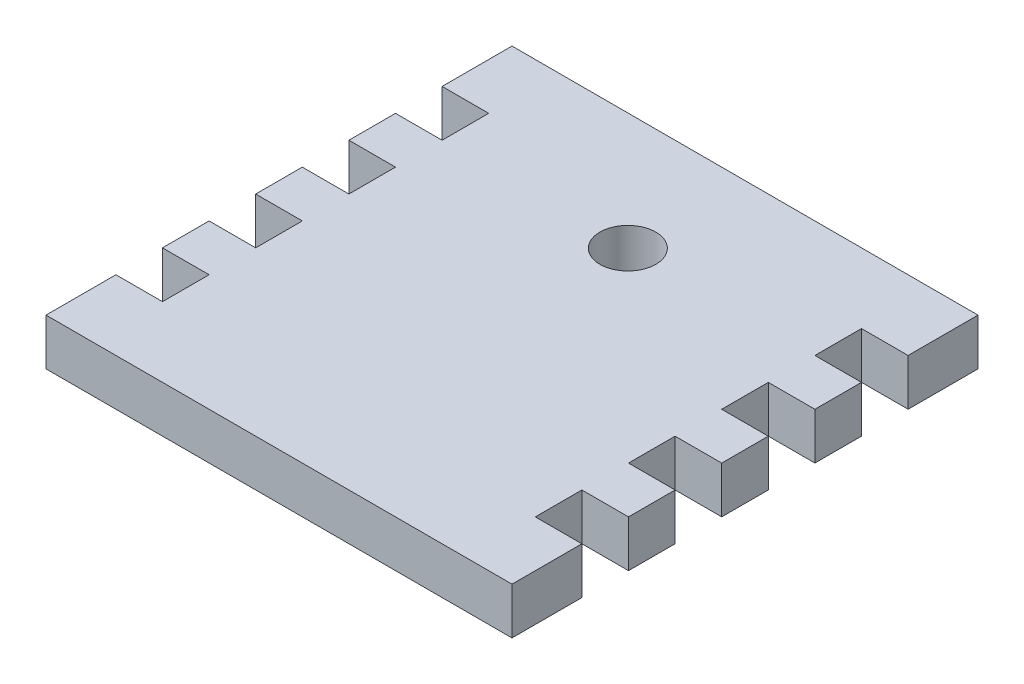
ISO-10303-21;
HEADER;
FILE_DESCRIPTION(('STEP AP214'),'2;1');
FILE_NAME('part.step','',(''),(''),'','','');
FILE_SCHEMA(('AUTOMOTIVE_DESIGN { 1 0 10303 214 1 1 1 1 }'));
ENDSEC;
DATA;
#1=APPLICATION_CONTEXT('core data for automotive mechanical design processes');
#2=APPLICATION_PROTOCOL_DEFINITION('international standard','automotive_design',2000,#1);
#3=PRODUCT_CONTEXT('',#1,'mechanical');
#4=PRODUCT('Part','Part','',(#3));
#5=PRODUCT_RELATED_PRODUCT_CATEGORY('part','',(#4));
#6=PRODUCT_DEFINITION_FORMATION('','',#4);
#7=PRODUCT_DEFINITION_CONTEXT('part definition',#1,'design');
#8=PRODUCT_DEFINITION('design','',#6,#7);
#9=PRODUCT_DEFINITION_SHAPE('','',#8);
#10=(LENGTH_UNIT() NAMED_UNIT(*) SI_UNIT(.MILLI.,.METRE.));
#11=(NAMED_UNIT(*) PLANE_ANGLE_UNIT() SI_UNIT($,.RADIAN.));
#12=(NAMED_UNIT(*) SI_UNIT($,.STERADIAN.) SOLID_ANGLE_UNIT());
#13=UNCERTAINTY_MEASURE_WITH_UNIT(LENGTH_MEASURE(1.E-05),#10,'distance_accuracy_value','');
#14=(GEOMETRIC_REPRESENTATION_CONTEXT(3) GLOBAL_UNCERTAINTY_ASSIGNED_CONTEXT((#13)) GLOBAL_UNIT_ASSIGNED_CONTEXT((#10,
#11,#12)) REPRESENTATION_CONTEXT('',''));
#15=CARTESIAN_POINT('',(0.,0.,0.));
#16=DIRECTION('',(0.,0.,1.));
#17=DIRECTION('',(1.,0.,0.));
#18=AXIS2_PLACEMENT_3D('',#15,#16,#17);
#19=CARTESIAN_POINT('',(-16.0108949416342,5.08,-17.8887159533074));
#20=DIRECTION('',(1.,0.,0.));
#21=DIRECTION('',(0.,0.,-1.));
#22=AXIS2_PLACEMENT_3D('',#19,#20,#21);
#23=PLANE('',#22);
#24=DIRECTION('',(0.,0.,1.));
#25=VECTOR('',#24,1.);
#26=CARTESIAN_POINT('',(-16.0108949416342,0.,-17.8887159533074));
#27=LINE('',#26,#25);
#28=CARTESIAN_POINT('',(-16.0108949416342,0.,4.97128404669261));
#29=VERTEX_POINT('',#28);
#30=CARTESIAN_POINT('',(-16.0108949416342,0.,10.0512840466926));
#31=VERTEX_POINT('',#30);
#32=EDGE_CURVE('E291',#29,#31,#27,.T.);
#33=ORIENTED_EDGE('',*,*,#32,.T.);
#34=DIRECTION('',(0.,1.,0.));
#35=VECTOR('',#34,1.);
#36=CARTESIAN_POINT('',(-16.0108949416342,0.,10.0512840466926));
#37=LINE('',#36,#35);
#38=CARTESIAN_POINT('',(-16.0108949416342,5.08,10.0512840466926));
#39=VERTEX_POINT('',#38);
#40=EDGE_CURVE('E496',#31,#39,#37,.T.);
#41=ORIENTED_EDGE('',*,*,#40,.T.);
#42=DIRECTION('',(0.,0.,1.));
#43=VECTOR('',#42,1.);
#44=CARTESIAN_POINT('',(-16.0108949416342,5.08,-17.8887159533074));
#45=LINE('',#44,#43);
#46=CARTESIAN_POINT('',(-16.0108949416342,5.08,4.97128404669261));
#47=VERTEX_POINT('',#46);
#48=EDGE_CURVE('E584',#47,#39,#45,.T.);
#49=ORIENTED_EDGE('',*,*,#48,.F.);
#50=DIRECTION('',(0.,1.,0.));
#51=VECTOR('',#50,1.);
#52=CARTESIAN_POINT('',(-16.0108949416342,0.,4.97128404669261));
#53=LINE('',#52,#51);
#54=EDGE_CURVE('E455',#29,#47,#53,.T.);
#55=ORIENTED_EDGE('',*,*,#54,.F.);
#56=EDGE_LOOP('',(#33,#41,#49,#55));
#57=FACE_BOUND('',#56,.T.);
#58=ADVANCED_FACE('F33',(#57),#23,.F.);
#59=CARTESIAN_POINT('',(-16.0108949416342,5.08,15.1312840466926));
#60=VERTEX_POINT('',#59);
#61=CARTESIAN_POINT('',(-16.0108949416342,5.08,20.2112840466926));
#62=VERTEX_POINT('',#61);
#63=EDGE_CURVE('E283',#60,#62,#45,.T.);
#64=ORIENTED_EDGE('',*,*,#63,.F.);
#65=DIRECTION('',(0.,1.,0.));
#66=VECTOR('',#65,1.);
#67=CARTESIAN_POINT('',(-16.0108949416342,0.,15.1312840466926));
#68=LINE('',#67,#66);
#69=CARTESIAN_POINT('',(-16.0108949416342,0.,15.1312840466926));
#70=VERTEX_POINT('',#69);
#71=EDGE_CURVE('E269',#70,#60,#68,.T.);
#72=ORIENTED_EDGE('',*,*,#71,.F.);
#73=CARTESIAN_POINT('',(-16.0108949416342,0.,20.2112840466926));
#74=VERTEX_POINT('',#73);
#75=EDGE_CURVE('E281',#70,#74,#27,.T.);
#76=ORIENTED_EDGE('',*,*,#75,.T.);
#77=DIRECTION('',(0.,1.,0.));
#78=VECTOR('',#77,1.);
#79=CARTESIAN_POINT('',(-16.0108949416342,0.,20.2112840466926));
#80=LINE('',#79,#78);
#81=EDGE_CURVE('E613',#74,#62,#80,.T.);
#82=ORIENTED_EDGE('',*,*,#81,.T.);
#83=EDGE_LOOP('',(#64,#72,#76,#82));
#84=FACE_BOUND('',#83,.T.);
#85=ADVANCED_FACE('F279',(#84),#23,.F.);
#86=CARTESIAN_POINT('',(-16.0108949416342,5.08,-5.18871595330739));
#87=VERTEX_POINT('',#86);
#88=CARTESIAN_POINT('',(-16.0108949416342,5.08,-0.108715953307394));
#89=VERTEX_POINT('',#88);
#90=EDGE_CURVE('E501',#87,#89,#45,.T.);
#91=ORIENTED_EDGE('',*,*,#90,.F.);
#92=DIRECTION('',(0.,1.,0.));
#93=VECTOR('',#92,1.);
#94=CARTESIAN_POINT('',(-16.0108949416342,0.,-5.18871595330739));
#95=LINE('',#94,#93);
#96=CARTESIAN_POINT('',(-16.0108949416342,0.,-5.18871595330739));
#97=VERTEX_POINT('',#96);
#98=EDGE_CURVE('E429',#97,#87,#95,.T.);
#99=ORIENTED_EDGE('',*,*,#98,.F.);
#100=CARTESIAN_POINT('',(-16.0108949416342,0.,-0.108715953307394));
#101=VERTEX_POINT('',#100);
#102=EDGE_CURVE('E295',#97,#101,#27,.T.);
#103=ORIENTED_EDGE('',*,*,#102,.T.);
#104=DIRECTION('',(0.,1.,0.));
#105=VECTOR('',#104,1.);
#106=CARTESIAN_POINT('',(-16.0108949416342,0.,-0.108715953307394));
#107=LINE('',#106,#105);
#108=EDGE_CURVE('E485',#101,#89,#107,.T.);
#109=ORIENTED_EDGE('',*,*,#108,.T.);
#110=EDGE_LOOP('',(#91,#99,#103,#109));
#111=FACE_BOUND('',#110,.T.);
#112=ADVANCED_FACE('F582',(#111),#23,.F.);
#113=CARTESIAN_POINT('',(-16.0108949416342,5.08,25.2912840466926));
#114=VERTEX_POINT('',#113);
#115=CARTESIAN_POINT('',(-16.0108949416342,5.08,32.9112840466926));
#116=VERTEX_POINT('',#115);
#117=EDGE_CURVE('E312',#114,#116,#45,.T.);
#118=ORIENTED_EDGE('',*,*,#117,.F.);
#119=DIRECTION('',(0.,1.,0.));
#120=VECTOR('',#119,1.);
#121=CARTESIAN_POINT('',(-16.0108949416342,0.,25.2912840466926));
#122=LINE('',#121,#120);
#123=CARTESIAN_POINT('',(-16.0108949416342,0.,25.2912840466926));
#124=VERTEX_POINT('',#123);
#125=EDGE_CURVE('E598',#124,#114,#122,.T.);
#126=ORIENTED_EDGE('',*,*,#125,.F.);
#127=CARTESIAN_POINT('',(-16.0108949416342,0.,32.9112840466926));
#128=VERTEX_POINT('',#127);
#129=EDGE_CURVE('E292',#124,#128,#27,.T.);
#130=ORIENTED_EDGE('',*,*,#129,.T.);
#131=DIRECTION('',(0.,-1.,0.));
#132=VECTOR('',#131,1.);
#133=CARTESIAN_POINT('',(-16.0108949416342,5.08,32.9112840466926));
#134=LINE('',#133,#132);
#135=EDGE_CURVE('E11',#116,#128,#134,.T.);
#136=ORIENTED_EDGE('',*,*,#135,.F.);
#137=EDGE_LOOP('',(#118,#126,#130,#136));
#138=FACE_BOUND('',#137,.T.);
#139=ADVANCED_FACE('F597',(#138),#23,.F.);
#140=CARTESIAN_POINT('',(34.7891050583658,5.08,-17.8887159533074));
#141=DIRECTION('',(-1.,0.,0.));
#142=DIRECTION('',(0.,0.,1.));
#143=AXIS2_PLACEMENT_3D('',#140,#141,#142);
#144=PLANE('',#143);
#145=DIRECTION('',(0.,0.,-1.));
#146=VECTOR('',#145,1.);
#147=CARTESIAN_POINT('',(34.7891050583658,5.08,-17.8887159533074));
#148=LINE('',#147,#146);
#149=CARTESIAN_POINT('',(34.7891050583658,5.08,20.2112840466926));
#150=VERTEX_POINT('',#149);
#151=CARTESIAN_POINT('',(34.7891050583658,5.08,15.1312840466926));
#152=VERTEX_POINT('',#151);
#153=EDGE_CURVE('E503',#150,#152,#148,.T.);
#154=ORIENTED_EDGE('',*,*,#153,.F.);
#155=DIRECTION('',(0.,1.,0.));
#156=VECTOR('',#155,1.);
#157=CARTESIAN_POINT('',(34.7891050583658,0.,20.2112840466926));
#158=LINE('',#157,#156);
#159=CARTESIAN_POINT('',(34.7891050583658,0.,20.2112840466926));
#160=VERTEX_POINT('',#159);
#161=EDGE_CURVE('E356',#160,#150,#158,.T.);
#162=ORIENTED_EDGE('',*,*,#161,.F.);
#163=DIRECTION('',(0.,0.,-1.));
#164=VECTOR('',#163,1.);
#165=CARTESIAN_POINT('',(34.7891050583658,0.,-17.8887159533074));
#166=LINE('',#165,#164);
#167=CARTESIAN_POINT('',(34.7891050583658,0.,15.1312840466926));
#168=VERTEX_POINT('',#167);
#169=EDGE_CURVE('E310',#160,#168,#166,.T.);
#170=ORIENTED_EDGE('',*,*,#169,.T.);
#171=DIRECTION('',(0.,1.,0.));
#172=VECTOR('',#171,1.);
#173=CARTESIAN_POINT('',(34.7891050583658,0.,15.1312840466926));
#174=LINE('',#173,#172);
#175=EDGE_CURVE('E382',#168,#152,#174,.T.);
#176=ORIENTED_EDGE('',*,*,#175,.T.);
#177=EDGE_LOOP('',(#154,#162,#170,#176));
#178=FACE_BOUND('',#177,.T.);
#179=ADVANCED_FACE('F628',(#178),#144,.F.);
#180=CARTESIAN_POINT('',(34.7891050583658,5.08,10.0512840466926));
#181=VERTEX_POINT('',#180);
#182=CARTESIAN_POINT('',(34.7891050583658,5.08,4.97128404669261));
#183=VERTEX_POINT('',#182);
#184=EDGE_CURVE('E507',#181,#183,#148,.T.);
#185=ORIENTED_EDGE('',*,*,#184,.F.);
#186=DIRECTION('',(0.,1.,0.));
#187=VECTOR('',#186,1.);
#188=CARTESIAN_POINT('',(34.7891050583658,0.,10.0512840466926));
#189=LINE('',#188,#187);
#190=CARTESIAN_POINT('',(34.7891050583658,0.,10.0512840466926));
#191=VERTEX_POINT('',#190);
#192=EDGE_CURVE('E351',#191,#181,#189,.T.);
#193=ORIENTED_EDGE('',*,*,#192,.F.);
#194=CARTESIAN_POINT('',(34.7891050583658,0.,4.97128404669261));
#195=VERTEX_POINT('',#194);
#196=EDGE_CURVE('E530',#191,#195,#166,.T.);
#197=ORIENTED_EDGE('',*,*,#196,.T.);
#198=DIRECTION('',(0.,1.,0.));
#199=VECTOR('',#198,1.);
#200=CARTESIAN_POINT('',(34.7891050583658,0.,4.97128404669261));
#201=LINE('',#200,#199);
#202=EDGE_CURVE('E377',#195,#183,#201,.T.);
#203=ORIENTED_EDGE('',*,*,#202,.T.);
#204=EDGE_LOOP('',(#185,#193,#197,#203));
#205=FACE_BOUND('',#204,.T.);
#206=ADVANCED_FACE('F527',(#205),#144,.F.);
#207=CARTESIAN_POINT('',(34.7891050583658,0.,32.9112840466926));
#208=VERTEX_POINT('',#207);
#209=CARTESIAN_POINT('',(34.7891050583658,0.,25.2912840466926));
#210=VERTEX_POINT('',#209);
#211=EDGE_CURVE('E306',#208,#210,#166,.T.);
#212=ORIENTED_EDGE('',*,*,#211,.T.);
#213=DIRECTION('',(0.,1.,0.));
#214=VECTOR('',#213,1.);
#215=CARTESIAN_POINT('',(34.7891050583658,0.,25.2912840466926));
#216=LINE('',#215,#214);
#217=CARTESIAN_POINT('',(34.7891050583658,5.08,25.2912840466926));
#218=VERTEX_POINT('',#217);
#219=EDGE_CURVE('E359',#210,#218,#216,.T.);
#220=ORIENTED_EDGE('',*,*,#219,.T.);
#221=CARTESIAN_POINT('',(34.7891050583658,5.08,32.9112840466926));
#222=VERTEX_POINT('',#221);
#223=EDGE_CURVE('E326',#222,#218,#148,.T.);
#224=ORIENTED_EDGE('',*,*,#223,.F.);
#225=DIRECTION('',(0.,-1.,0.));
#226=VECTOR('',#225,1.);
#227=CARTESIAN_POINT('',(34.7891050583658,5.08,32.9112840466926));
#228=LINE('',#227,#226);
#229=EDGE_CURVE('E41',#222,#208,#228,.T.);
#230=ORIENTED_EDGE('',*,*,#229,.T.);
#231=EDGE_LOOP('',(#212,#220,#224,#230));
#232=FACE_BOUND('',#231,.T.);
#233=ADVANCED_FACE('F323',(#232),#144,.F.);
#234=CARTESIAN_POINT('',(34.7891050583658,5.08,-0.108715953307394));
#235=VERTEX_POINT('',#234);
#236=CARTESIAN_POINT('',(34.7891050583658,5.08,-5.18871595330739));
#237=VERTEX_POINT('',#236);
#238=EDGE_CURVE('E508',#235,#237,#148,.T.);
#239=ORIENTED_EDGE('',*,*,#238,.F.);
#240=DIRECTION('',(0.,1.,0.));
#241=VECTOR('',#240,1.);
#242=CARTESIAN_POINT('',(34.7891050583658,0.,-0.108715953307394));
#243=LINE('',#242,#241);
#244=CARTESIAN_POINT('',(34.7891050583658,0.,-0.108715953307394));
#245=VERTEX_POINT('',#244);
#246=EDGE_CURVE('E398',#245,#235,#243,.T.);
#247=ORIENTED_EDGE('',*,*,#246,.F.);
#248=CARTESIAN_POINT('',(34.7891050583658,0.,-5.18871595330739));
#249=VERTEX_POINT('',#248);
#250=EDGE_CURVE('E544',#245,#249,#166,.T.);
#251=ORIENTED_EDGE('',*,*,#250,.T.);
#252=DIRECTION('',(0.,1.,0.));
#253=VECTOR('',#252,1.);
#254=CARTESIAN_POINT('',(34.7891050583658,0.,-5.18871595330739));
#255=LINE('',#254,#253);
#256=EDGE_CURVE('E403',#249,#237,#255,.T.);
#257=ORIENTED_EDGE('',*,*,#256,.T.);
#258=EDGE_LOOP('',(#239,#247,#251,#257));
#259=FACE_BOUND('',#258,.T.);
#260=ADVANCED_FACE('F542',(#259),#144,.F.);
#261=CARTESIAN_POINT('',(-16.0108949416342,0.,-17.8887159533074));
#262=VERTEX_POINT('',#261);
#263=CARTESIAN_POINT('',(-16.0108949416342,0.,-10.2687159533074));
#264=VERTEX_POINT('',#263);
#265=EDGE_CURVE('E297',#262,#264,#27,.T.);
#266=ORIENTED_EDGE('',*,*,#265,.T.);
#267=DIRECTION('',(0.,1.,0.));
#268=VECTOR('',#267,1.);
#269=CARTESIAN_POINT('',(-16.0108949416342,0.,-10.2687159533074));
#270=LINE('',#269,#268);
#271=CARTESIAN_POINT('',(-16.0108949416342,5.08,-10.2687159533074));
#272=VERTEX_POINT('',#271);
#273=EDGE_CURVE('E460',#264,#272,#270,.T.);
#274=ORIENTED_EDGE('',*,*,#273,.T.);
#275=CARTESIAN_POINT('',(-16.0108949416342,5.08,-17.8887159533074));
#276=VERTEX_POINT('',#275);
#277=EDGE_CURVE('E497',#276,#272,#45,.T.);
#278=ORIENTED_EDGE('',*,*,#277,.F.);
#279=DIRECTION('',(0.,-1.,0.));
#280=VECTOR('',#279,1.);
#281=CARTESIAN_POINT('',(-16.0108949416342,5.08,-17.8887159533074));
#282=LINE('',#281,#280);
#283=EDGE_CURVE('E313',#276,#262,#282,.T.);
#284=ORIENTED_EDGE('',*,*,#283,.T.);
#285=EDGE_LOOP('',(#266,#274,#278,#284));
#286=FACE_BOUND('',#285,.T.);
#287=ADVANCED_FACE('F35',(#286),#23,.F.);
#288=CARTESIAN_POINT('',(-16.0108949416342,5.08,32.9112840466926));
#289=DIRECTION('',(0.,0.,-1.));
#290=DIRECTION('',(-1.,0.,0.));
#291=AXIS2_PLACEMENT_3D('',#288,#289,#290);
#292=PLANE('',#291);
#293=DIRECTION('',(1.,0.,0.));
#294=VECTOR('',#293,1.);
#295=CARTESIAN_POINT('',(-16.0108949416342,0.,32.9112840466926));
#296=LINE('',#295,#294);
#297=EDGE_CURVE('E301',#128,#208,#296,.T.);
#298=ORIENTED_EDGE('',*,*,#297,.T.);
#299=ORIENTED_EDGE('',*,*,#229,.F.);
#300=DIRECTION('',(1.,0.,0.));
#301=VECTOR('',#300,1.);
#302=CARTESIAN_POINT('',(-16.0108949416342,5.08,32.9112840466926));
#303=LINE('',#302,#301);
#304=EDGE_CURVE('E500',#116,#222,#303,.T.);
#305=ORIENTED_EDGE('',*,*,#304,.F.);
#306=ORIENTED_EDGE('',*,*,#135,.T.);
#307=EDGE_LOOP('',(#298,#299,#305,#306));
#308=FACE_BOUND('',#307,.T.);
#309=ADVANCED_FACE('F596',(#308),#292,.F.);
#310=CARTESIAN_POINT('',(34.7891050583658,5.08,-10.2687159533074));
#311=VERTEX_POINT('',#310);
#312=CARTESIAN_POINT('',(34.7891050583658,5.08,-17.8887159533074));
#313=VERTEX_POINT('',#312);
#314=EDGE_CURVE('E502',#311,#313,#148,.T.);
#315=ORIENTED_EDGE('',*,*,#314,.F.);
#316=DIRECTION('',(0.,1.,0.));
#317=VECTOR('',#316,1.);
#318=CARTESIAN_POINT('',(34.7891050583658,0.,-10.2687159533074));
#319=LINE('',#318,#317);
#320=CARTESIAN_POINT('',(34.7891050583658,0.,-10.2687159533074));
#321=VERTEX_POINT('',#320);
#322=EDGE_CURVE('E424',#321,#311,#319,.T.);
#323=ORIENTED_EDGE('',*,*,#322,.F.);
#324=CARTESIAN_POINT('',(34.7891050583658,0.,-17.8887159533074));
#325=VERTEX_POINT('',#324);
#326=EDGE_CURVE('E305',#321,#325,#166,.T.);
#327=ORIENTED_EDGE('',*,*,#326,.T.);
#328=DIRECTION('',(0.,-1.,0.));
#329=VECTOR('',#328,1.);
#330=CARTESIAN_POINT('',(34.7891050583658,5.08,-17.8887159533074));
#331=LINE('',#330,#329);
#332=EDGE_CURVE('E316',#313,#325,#331,.T.);
#333=ORIENTED_EDGE('',*,*,#332,.F.);
#334=EDGE_LOOP('',(#315,#323,#327,#333));
#335=FACE_BOUND('',#334,.T.);
#336=ADVANCED_FACE('F557',(#335),#144,.F.);
#337=CARTESIAN_POINT('',(-16.0108949416342,5.08,-17.8887159533074));
#338=DIRECTION('',(0.,0.,1.));
#339=DIRECTION('',(1.,0.,0.));
#340=AXIS2_PLACEMENT_3D('',#337,#338,#339);
#341=PLANE('',#340);
#342=DIRECTION('',(-1.,0.,0.));
#343=VECTOR('',#342,1.);
#344=CARTESIAN_POINT('',(-16.0108949416342,0.,-17.8887159533074));
#345=LINE('',#344,#343);
#346=EDGE_CURVE('E309',#325,#262,#345,.T.);
#347=ORIENTED_EDGE('',*,*,#346,.T.);
#348=ORIENTED_EDGE('',*,*,#283,.F.);
#349=DIRECTION('',(-1.,0.,0.));
#350=VECTOR('',#349,1.);
#351=CARTESIAN_POINT('',(-16.0108949416342,5.08,-17.8887159533074));
#352=LINE('',#351,#350);
#353=EDGE_CURVE('E302',#313,#276,#352,.T.);
#354=ORIENTED_EDGE('',*,*,#353,.F.);
#355=ORIENTED_EDGE('',*,*,#332,.T.);
#356=EDGE_LOOP('',(#347,#348,#354,#355));
#357=FACE_BOUND('',#356,.T.);
#358=ADVANCED_FACE('F562',(#357),#341,.F.);
#359=CARTESIAN_POINT('',(0.,5.08,0.));
#360=DIRECTION('',(0.,1.,0.));
#361=DIRECTION('',(0.,0.,1.));
#362=AXIS2_PLACEMENT_3D('',#359,#360,#361);
#363=PLANE('',#362);
#364=DIRECTION('',(-1.,0.,0.));
#365=VECTOR('',#364,1.);
#366=CARTESIAN_POINT('',(-16.0108949416342,5.08,10.0512840466926));
#367=LINE('',#366,#365);
#368=CARTESIAN_POINT('',(-10.9308949416342,5.08,10.0512840466926));
#369=VERTEX_POINT('',#368);
#370=EDGE_CURVE('E274',#369,#39,#367,.T.);
#371=ORIENTED_EDGE('',*,*,#370,.F.);
#372=DIRECTION('',(0.,0.,-1.));
#373=VECTOR('',#372,1.);
#374=CARTESIAN_POINT('',(-10.9308949416342,5.08,10.0512840466926));
#375=LINE('',#374,#373);
#376=CARTESIAN_POINT('',(-10.9308949416342,5.08,15.1312840466926));
#377=VERTEX_POINT('',#376);
#378=EDGE_CURVE('E929',#377,#369,#375,.T.);
#379=ORIENTED_EDGE('',*,*,#378,.F.);
#380=DIRECTION('',(1.,0.,0.));
#381=VECTOR('',#380,1.);
#382=CARTESIAN_POINT('',(-16.0108949416342,5.08,15.1312840466926));
#383=LINE('',#382,#381);
#384=EDGE_CURVE('E615',#60,#377,#383,.T.);
#385=ORIENTED_EDGE('',*,*,#384,.F.);
#386=ORIENTED_EDGE('',*,*,#63,.T.);
#387=DIRECTION('',(-1.,0.,0.));
#388=VECTOR('',#387,1.);
#389=CARTESIAN_POINT('',(-16.0108949416342,5.08,20.2112840466926));
#390=LINE('',#389,#388);
#391=CARTESIAN_POINT('',(-10.9308949416342,5.08,20.2112840466926));
#392=VERTEX_POINT('',#391);
#393=EDGE_CURVE('E602',#392,#62,#390,.T.);
#394=ORIENTED_EDGE('',*,*,#393,.F.);
#395=DIRECTION('',(0.,0.,-1.));
#396=VECTOR('',#395,1.);
#397=CARTESIAN_POINT('',(-10.9308949416342,5.08,20.2112840466926));
#398=LINE('',#397,#396);
#399=CARTESIAN_POINT('',(-10.9308949416342,5.08,25.2912840466926));
#400=VERTEX_POINT('',#399);
#401=EDGE_CURVE('E605',#400,#392,#398,.T.);
#402=ORIENTED_EDGE('',*,*,#401,.F.);
#403=DIRECTION('',(1.,0.,0.));
#404=VECTOR('',#403,1.);
#405=CARTESIAN_POINT('',(-16.0108949416342,5.08,25.2912840466926));
#406=LINE('',#405,#404);
#407=EDGE_CURVE('E358',#114,#400,#406,.T.);
#408=ORIENTED_EDGE('',*,*,#407,.F.);
#409=ORIENTED_EDGE('',*,*,#117,.T.);
#410=ORIENTED_EDGE('',*,*,#304,.T.);
#411=ORIENTED_EDGE('',*,*,#223,.T.);
#412=DIRECTION('',(1.,0.,0.));
#413=VECTOR('',#412,1.);
#414=CARTESIAN_POINT('',(34.7891050583658,5.08,25.2912840466926));
#415=LINE('',#414,#413);
#416=CARTESIAN_POINT('',(29.7091050583658,5.08,25.2912840466926));
#417=VERTEX_POINT('',#416);
#418=EDGE_CURVE('E354',#417,#218,#415,.T.);
#419=ORIENTED_EDGE('',*,*,#418,.F.);
#420=DIRECTION('',(0.,0.,1.));
#421=VECTOR('',#420,1.);
#422=CARTESIAN_POINT('',(29.7091050583658,5.08,20.2112840466926));
#423=LINE('',#422,#421);
#424=CARTESIAN_POINT('',(29.7091050583658,5.08,20.2112840466926));
#425=VERTEX_POINT('',#424);
#426=EDGE_CURVE('E350',#425,#417,#423,.T.);
#427=ORIENTED_EDGE('',*,*,#426,.F.);
#428=DIRECTION('',(-1.,0.,0.));
#429=VECTOR('',#428,1.);
#430=CARTESIAN_POINT('',(34.7891050583658,5.08,20.2112840466926));
#431=LINE('',#430,#429);
#432=EDGE_CURVE('E347',#150,#425,#431,.T.);
#433=ORIENTED_EDGE('',*,*,#432,.F.);
#434=ORIENTED_EDGE('',*,*,#153,.T.);
#435=DIRECTION('',(1.,0.,0.));
#436=VECTOR('',#435,1.);
#437=CARTESIAN_POINT('',(34.7891050583658,5.08,15.1312840466926));
#438=LINE('',#437,#436);
#439=CARTESIAN_POINT('',(29.7091050583658,5.08,15.1312840466926));
#440=VERTEX_POINT('',#439);
#441=EDGE_CURVE('E366',#440,#152,#438,.T.);
#442=ORIENTED_EDGE('',*,*,#441,.F.);
#443=DIRECTION('',(0.,0.,1.));
#444=VECTOR('',#443,1.);
#445=CARTESIAN_POINT('',(29.7091050583658,5.08,10.0512840466926));
#446=LINE('',#445,#444);
#447=CARTESIAN_POINT('',(29.7091050583658,5.08,10.0512840466926));
#448=VERTEX_POINT('',#447);
#449=EDGE_CURVE('E376',#448,#440,#446,.T.);
#450=ORIENTED_EDGE('',*,*,#449,.F.);
#451=DIRECTION('',(-1.,0.,0.));
#452=VECTOR('',#451,1.);
#453=CARTESIAN_POINT('',(34.7891050583658,5.08,10.0512840466926));
#454=LINE('',#453,#452);
#455=EDGE_CURVE('E373',#181,#448,#454,.T.);
#456=ORIENTED_EDGE('',*,*,#455,.F.);
#457=ORIENTED_EDGE('',*,*,#184,.T.);
#458=DIRECTION('',(1.,0.,0.));
#459=VECTOR('',#458,1.);
#460=CARTESIAN_POINT('',(34.7891050583658,5.08,4.97128404669261));
#461=LINE('',#460,#459);
#462=CARTESIAN_POINT('',(29.7091050583658,5.08,4.97128404669261));
#463=VERTEX_POINT('',#462);
#464=EDGE_CURVE('E392',#463,#183,#461,.T.);
#465=ORIENTED_EDGE('',*,*,#464,.F.);
#466=DIRECTION('',(0.,0.,1.));
#467=VECTOR('',#466,1.);
#468=CARTESIAN_POINT('',(29.7091050583658,5.08,4.97128404669261));
#469=LINE('',#468,#467);
#470=CARTESIAN_POINT('',(29.7091050583658,5.08,-0.108715953307394));
#471=VERTEX_POINT('',#470);
#472=EDGE_CURVE('E402',#471,#463,#469,.T.);
#473=ORIENTED_EDGE('',*,*,#472,.F.);
#474=DIRECTION('',(-1.,0.,0.));
#475=VECTOR('',#474,1.);
#476=CARTESIAN_POINT('',(34.7891050583658,5.08,-0.108715953307394));
#477=LINE('',#476,#475);
#478=EDGE_CURVE('E399',#235,#471,#477,.T.);
#479=ORIENTED_EDGE('',*,*,#478,.F.);
#480=ORIENTED_EDGE('',*,*,#238,.T.);
#481=DIRECTION('',(1.,0.,0.));
#482=VECTOR('',#481,1.);
#483=CARTESIAN_POINT('',(34.7891050583658,5.08,-5.18871595330739));
#484=LINE('',#483,#482);
#485=CARTESIAN_POINT('',(29.7091050583658,5.08,-5.18871595330739));
#486=VERTEX_POINT('',#485);
#487=EDGE_CURVE('E418',#486,#237,#484,.T.);
#488=ORIENTED_EDGE('',*,*,#487,.F.);
#489=DIRECTION('',(0.,0.,1.));
#490=VECTOR('',#489,1.);
#491=CARTESIAN_POINT('',(29.7091050583658,5.08,-5.18871595330739));
#492=LINE('',#491,#490);
#493=CARTESIAN_POINT('',(29.7091050583658,5.08,-10.2687159533074));
#494=VERTEX_POINT('',#493);
#495=EDGE_CURVE('E428',#494,#486,#492,.T.);
#496=ORIENTED_EDGE('',*,*,#495,.F.);
#497=DIRECTION('',(-1.,0.,0.));
#498=VECTOR('',#497,1.);
#499=CARTESIAN_POINT('',(34.7891050583658,5.08,-10.2687159533074));
#500=LINE('',#499,#498);
#501=EDGE_CURVE('E425',#311,#494,#500,.T.);
#502=ORIENTED_EDGE('',*,*,#501,.F.);
#503=ORIENTED_EDGE('',*,*,#314,.T.);
#504=ORIENTED_EDGE('',*,*,#353,.T.);
#505=ORIENTED_EDGE('',*,*,#277,.T.);
#506=DIRECTION('',(-1.,0.,0.));
#507=VECTOR('',#506,1.);
#508=CARTESIAN_POINT('',(-16.0108949416342,5.08,-10.2687159533074));
#509=LINE('',#508,#507);
#510=CARTESIAN_POINT('',(-10.9308949416342,5.08,-10.2687159533074));
#511=VERTEX_POINT('',#510);
#512=EDGE_CURVE('E444',#511,#272,#509,.T.);
#513=ORIENTED_EDGE('',*,*,#512,.F.);
#514=DIRECTION('',(0.,0.,-1.));
#515=VECTOR('',#514,1.);
#516=CARTESIAN_POINT('',(-10.9308949416342,5.08,-5.18871595330739));
#517=LINE('',#516,#515);
#518=CARTESIAN_POINT('',(-10.9308949416342,5.08,-5.18871595330739));
#519=VERTEX_POINT('',#518);
#520=EDGE_CURVE('E454',#519,#511,#517,.T.);
#521=ORIENTED_EDGE('',*,*,#520,.F.);
#522=DIRECTION('',(1.,0.,0.));
#523=VECTOR('',#522,1.);
#524=CARTESIAN_POINT('',(-16.0108949416342,5.08,-5.18871595330739));
#525=LINE('',#524,#523);
#526=EDGE_CURVE('E451',#87,#519,#525,.T.);
#527=ORIENTED_EDGE('',*,*,#526,.F.);
#528=ORIENTED_EDGE('',*,*,#90,.T.);
#529=DIRECTION('',(-1.,0.,0.));
#530=VECTOR('',#529,1.);
#531=CARTESIAN_POINT('',(-16.0108949416342,5.08,-0.108715953307394));
#532=LINE('',#531,#530);
#533=CARTESIAN_POINT('',(-10.9308949416342,5.08,-0.108715953307394));
#534=VERTEX_POINT('',#533);
#535=EDGE_CURVE('E470',#534,#89,#532,.T.);
#536=ORIENTED_EDGE('',*,*,#535,.F.);
#537=DIRECTION('',(0.,0.,-1.));
#538=VECTOR('',#537,1.);
#539=CARTESIAN_POINT('',(-10.9308949416342,5.08,4.97128404669261));
#540=LINE('',#539,#538);
#541=CARTESIAN_POINT('',(-10.9308949416342,5.08,4.97128404669261));
#542=VERTEX_POINT('',#541);
#543=EDGE_CURVE('E480',#542,#534,#540,.T.);
#544=ORIENTED_EDGE('',*,*,#543,.F.);
#545=DIRECTION('',(1.,0.,0.));
#546=VECTOR('',#545,1.);
#547=CARTESIAN_POINT('',(-16.0108949416342,5.08,4.97128404669261));
#548=LINE('',#547,#546);
#549=EDGE_CURVE('E477',#47,#542,#548,.T.);
#550=ORIENTED_EDGE('',*,*,#549,.F.);
#551=ORIENTED_EDGE('',*,*,#48,.T.);
#552=EDGE_LOOP('',(#371,#379,#385,#386,#394,#402,#408,#409,#410,#411,#419,#427,#433,#434,#442,
#450,#456,#457,#465,#473,#479,#480,#488,#496,#502,#503,#504,#505,#513,#521,#527,#528,#536,#544,
#550,#551));
#553=FACE_BOUND('',#552,.T.);
#554=CARTESIAN_POINT('',(9.38910505836576,5.08,-5.1201359533074));
#555=DIRECTION('',(0.,1.,0.));
#556=DIRECTION('',(0.,0.,1.));
#557=AXIS2_PLACEMENT_3D('',#554,#555,#556);
#558=CIRCLE('',#557,3.048);
#559=CARTESIAN_POINT('',(9.38910505836576,5.08,-2.0721359533074));
#560=VERTEX_POINT('',#559);
#561=EDGE_CURVE('E493',#560,#560,#558,.T.);
#562=ORIENTED_EDGE('',*,*,#561,.F.);
#563=EDGE_LOOP('',(#562));
#564=FACE_BOUND('',#563,.T.);
#565=ADVANCED_FACE('F521',(#553,#564),#363,.T.);
#566=CARTESIAN_POINT('',(0.,0.,0.));
#567=DIRECTION('',(0.,1.,0.));
#568=DIRECTION('',(0.,0.,1.));
#569=AXIS2_PLACEMENT_3D('',#566,#567,#568);
#570=PLANE('',#569);
#571=DIRECTION('',(0.,0.,-1.));
#572=VECTOR('',#571,1.);
#573=CARTESIAN_POINT('',(-10.9308949416342,0.,10.0512840466926));
#574=LINE('',#573,#572);
#575=CARTESIAN_POINT('',(-10.9308949416342,0.,15.1312840466926));
#576=VERTEX_POINT('',#575);
#577=CARTESIAN_POINT('',(-10.9308949416342,0.,10.0512840466926));
#578=VERTEX_POINT('',#577);
#579=EDGE_CURVE('E48',#576,#578,#574,.T.);
#580=ORIENTED_EDGE('',*,*,#579,.T.);
#581=DIRECTION('',(-1.,0.,0.));
#582=VECTOR('',#581,1.);
#583=CARTESIAN_POINT('',(-16.0108949416342,0.,10.0512840466926));
#584=LINE('',#583,#582);
#585=EDGE_CURVE('E284',#578,#31,#584,.T.);
#586=ORIENTED_EDGE('',*,*,#585,.T.);
#587=ORIENTED_EDGE('',*,*,#32,.F.);
#588=DIRECTION('',(1.,0.,0.));
#589=VECTOR('',#588,1.);
#590=CARTESIAN_POINT('',(-16.0108949416342,0.,4.97128404669261));
#591=LINE('',#590,#589);
#592=CARTESIAN_POINT('',(-10.9308949416342,0.,4.97128404669261));
#593=VERTEX_POINT('',#592);
#594=EDGE_CURVE('E466',#29,#593,#591,.T.);
#595=ORIENTED_EDGE('',*,*,#594,.T.);
#596=DIRECTION('',(0.,0.,-1.));
#597=VECTOR('',#596,1.);
#598=CARTESIAN_POINT('',(-10.9308949416342,0.,4.97128404669261));
#599=LINE('',#598,#597);
#600=CARTESIAN_POINT('',(-10.9308949416342,0.,-0.108715953307394));
#601=VERTEX_POINT('',#600);
#602=EDGE_CURVE('E469',#593,#601,#599,.T.);
#603=ORIENTED_EDGE('',*,*,#602,.T.);
#604=DIRECTION('',(-1.,0.,0.));
#605=VECTOR('',#604,1.);
#606=CARTESIAN_POINT('',(-16.0108949416342,0.,-0.108715953307394));
#607=LINE('',#606,#605);
#608=EDGE_CURVE('E473',#601,#101,#607,.T.);
#609=ORIENTED_EDGE('',*,*,#608,.T.);
#610=ORIENTED_EDGE('',*,*,#102,.F.);
#611=DIRECTION('',(1.,0.,0.));
#612=VECTOR('',#611,1.);
#613=CARTESIAN_POINT('',(-16.0108949416342,0.,-5.18871595330739));
#614=LINE('',#613,#612);
#615=CARTESIAN_POINT('',(-10.9308949416342,0.,-5.18871595330739));
#616=VERTEX_POINT('',#615);
#617=EDGE_CURVE('E440',#97,#616,#614,.T.);
#618=ORIENTED_EDGE('',*,*,#617,.T.);
#619=DIRECTION('',(0.,0.,-1.));
#620=VECTOR('',#619,1.);
#621=CARTESIAN_POINT('',(-10.9308949416342,0.,-5.18871595330739));
#622=LINE('',#621,#620);
#623=CARTESIAN_POINT('',(-10.9308949416342,0.,-10.2687159533074));
#624=VERTEX_POINT('',#623);
#625=EDGE_CURVE('E443',#616,#624,#622,.T.);
#626=ORIENTED_EDGE('',*,*,#625,.T.);
#627=DIRECTION('',(-1.,0.,0.));
#628=VECTOR('',#627,1.);
#629=CARTESIAN_POINT('',(-16.0108949416342,0.,-10.2687159533074));
#630=LINE('',#629,#628);
#631=EDGE_CURVE('E447',#624,#264,#630,.T.);
#632=ORIENTED_EDGE('',*,*,#631,.T.);
#633=ORIENTED_EDGE('',*,*,#265,.F.);
#634=ORIENTED_EDGE('',*,*,#346,.F.);
#635=ORIENTED_EDGE('',*,*,#326,.F.);
#636=DIRECTION('',(-1.,0.,0.));
#637=VECTOR('',#636,1.);
#638=CARTESIAN_POINT('',(34.7891050583658,0.,-10.2687159533074));
#639=LINE('',#638,#637);
#640=CARTESIAN_POINT('',(29.7091050583658,0.,-10.2687159533074));
#641=VERTEX_POINT('',#640);
#642=EDGE_CURVE('E414',#321,#641,#639,.T.);
#643=ORIENTED_EDGE('',*,*,#642,.T.);
#644=DIRECTION('',(0.,0.,1.));
#645=VECTOR('',#644,1.);
#646=CARTESIAN_POINT('',(29.7091050583658,0.,-5.18871595330739));
#647=LINE('',#646,#645);
#648=CARTESIAN_POINT('',(29.7091050583658,0.,-5.18871595330739));
#649=VERTEX_POINT('',#648);
#650=EDGE_CURVE('E417',#641,#649,#647,.T.);
#651=ORIENTED_EDGE('',*,*,#650,.T.);
#652=DIRECTION('',(1.,0.,0.));
#653=VECTOR('',#652,1.);
#654=CARTESIAN_POINT('',(34.7891050583658,0.,-5.18871595330739));
#655=LINE('',#654,#653);
#656=EDGE_CURVE('E421',#649,#249,#655,.T.);
#657=ORIENTED_EDGE('',*,*,#656,.T.);
#658=ORIENTED_EDGE('',*,*,#250,.F.);
#659=DIRECTION('',(-1.,0.,0.));
#660=VECTOR('',#659,1.);
#661=CARTESIAN_POINT('',(34.7891050583658,0.,-0.108715953307394));
#662=LINE('',#661,#660);
#663=CARTESIAN_POINT('',(29.7091050583658,0.,-0.108715953307394));
#664=VERTEX_POINT('',#663);
#665=EDGE_CURVE('E388',#245,#664,#662,.T.);
#666=ORIENTED_EDGE('',*,*,#665,.T.);
#667=DIRECTION('',(0.,0.,1.));
#668=VECTOR('',#667,1.);
#669=CARTESIAN_POINT('',(29.7091050583658,0.,4.97128404669261));
#670=LINE('',#669,#668);
#671=CARTESIAN_POINT('',(29.7091050583658,0.,4.97128404669261));
#672=VERTEX_POINT('',#671);
#673=EDGE_CURVE('E391',#664,#672,#670,.T.);
#674=ORIENTED_EDGE('',*,*,#673,.T.);
#675=DIRECTION('',(1.,0.,0.));
#676=VECTOR('',#675,1.);
#677=CARTESIAN_POINT('',(34.7891050583658,0.,4.97128404669261));
#678=LINE('',#677,#676);
#679=EDGE_CURVE('E395',#672,#195,#678,.T.);
#680=ORIENTED_EDGE('',*,*,#679,.T.);
#681=ORIENTED_EDGE('',*,*,#196,.F.);
#682=DIRECTION('',(-1.,0.,0.));
#683=VECTOR('',#682,1.);
#684=CARTESIAN_POINT('',(34.7891050583658,0.,10.0512840466926));
#685=LINE('',#684,#683);
#686=CARTESIAN_POINT('',(29.7091050583658,0.,10.0512840466926));
#687=VERTEX_POINT('',#686);
#688=EDGE_CURVE('E362',#191,#687,#685,.T.);
#689=ORIENTED_EDGE('',*,*,#688,.T.);
#690=DIRECTION('',(0.,0.,1.));
#691=VECTOR('',#690,1.);
#692=CARTESIAN_POINT('',(29.7091050583658,0.,10.0512840466926));
#693=LINE('',#692,#691);
#694=CARTESIAN_POINT('',(29.7091050583658,0.,15.1312840466926));
#695=VERTEX_POINT('',#694);
#696=EDGE_CURVE('E365',#687,#695,#693,.T.);
#697=ORIENTED_EDGE('',*,*,#696,.T.);
#698=DIRECTION('',(1.,0.,0.));
#699=VECTOR('',#698,1.);
#700=CARTESIAN_POINT('',(34.7891050583658,0.,15.1312840466926));
#701=LINE('',#700,#699);
#702=EDGE_CURVE('E369',#695,#168,#701,.T.);
#703=ORIENTED_EDGE('',*,*,#702,.T.);
#704=ORIENTED_EDGE('',*,*,#169,.F.);
#705=DIRECTION('',(-1.,0.,0.));
#706=VECTOR('',#705,1.);
#707=CARTESIAN_POINT('',(34.7891050583658,0.,20.2112840466926));
#708=LINE('',#707,#706);
#709=CARTESIAN_POINT('',(29.7091050583658,0.,20.2112840466926));
#710=VERTEX_POINT('',#709);
#711=EDGE_CURVE('E343',#160,#710,#708,.T.);
#712=ORIENTED_EDGE('',*,*,#711,.T.);
#713=DIRECTION('',(0.,0.,1.));
#714=VECTOR('',#713,1.);
#715=CARTESIAN_POINT('',(29.7091050583658,0.,20.2112840466926));
#716=LINE('',#715,#714);
#717=CARTESIAN_POINT('',(29.7091050583658,0.,25.2912840466926));
#718=VERTEX_POINT('',#717);
#719=EDGE_CURVE('E336',#710,#718,#716,.T.);
#720=ORIENTED_EDGE('',*,*,#719,.T.);
#721=DIRECTION('',(1.,0.,0.));
#722=VECTOR('',#721,1.);
#723=CARTESIAN_POINT('',(34.7891050583658,0.,25.2912840466926));
#724=LINE('',#723,#722);
#725=EDGE_CURVE('E333',#718,#210,#724,.T.);
#726=ORIENTED_EDGE('',*,*,#725,.T.);
#727=ORIENTED_EDGE('',*,*,#211,.F.);
#728=ORIENTED_EDGE('',*,*,#297,.F.);
#729=ORIENTED_EDGE('',*,*,#129,.F.);
#730=DIRECTION('',(1.,0.,0.));
#731=VECTOR('',#730,1.);
#732=CARTESIAN_POINT('',(-16.0108949416342,0.,25.2912840466926));
#733=LINE('',#732,#731);
#734=CARTESIAN_POINT('',(-10.9308949416342,0.,25.2912840466926));
#735=VERTEX_POINT('',#734);
#736=EDGE_CURVE('E600',#124,#735,#733,.T.);
#737=ORIENTED_EDGE('',*,*,#736,.T.);
#738=DIRECTION('',(0.,0.,-1.));
#739=VECTOR('',#738,1.);
#740=CARTESIAN_POINT('',(-10.9308949416342,0.,20.2112840466926));
#741=LINE('',#740,#739);
#742=CARTESIAN_POINT('',(-10.9308949416342,0.,20.2112840466926));
#743=VERTEX_POINT('',#742);
#744=EDGE_CURVE('E56',#735,#743,#741,.T.);
#745=ORIENTED_EDGE('',*,*,#744,.T.);
#746=DIRECTION('',(-1.,0.,0.));
#747=VECTOR('',#746,1.);
#748=CARTESIAN_POINT('',(-16.0108949416342,0.,20.2112840466926));
#749=LINE('',#748,#747);
#750=EDGE_CURVE('E290',#743,#74,#749,.T.);
#751=ORIENTED_EDGE('',*,*,#750,.T.);
#752=ORIENTED_EDGE('',*,*,#75,.F.);
#753=DIRECTION('',(1.,0.,0.));
#754=VECTOR('',#753,1.);
#755=CARTESIAN_POINT('',(-16.0108949416342,0.,15.1312840466926));
#756=LINE('',#755,#754);
#757=EDGE_CURVE('E265',#70,#576,#756,.T.);
#758=ORIENTED_EDGE('',*,*,#757,.T.);
#759=EDGE_LOOP('',(#580,#586,#587,#595,#603,#609,#610,#618,#626,#632,#633,#634,#635,#643,#651,
#657,#658,#666,#674,#680,#681,#689,#697,#703,#704,#712,#720,#726,#727,#728,#729,#737,#745,#751,
#752,#758));
#760=FACE_BOUND('',#759,.T.);
#761=CARTESIAN_POINT('',(9.38910505836576,0.,-5.1201359533074));
#762=DIRECTION('',(0.,1.,0.));
#763=DIRECTION('',(0.,0.,1.));
#764=AXIS2_PLACEMENT_3D('',#761,#762,#763);
#765=CIRCLE('',#764,3.048);
#766=CARTESIAN_POINT('',(9.38910505836576,0.,-2.0721359533074));
#767=VERTEX_POINT('',#766);
#768=EDGE_CURVE('E296',#767,#767,#765,.T.);
#769=ORIENTED_EDGE('',*,*,#768,.T.);
#770=EDGE_LOOP('',(#769));
#771=FACE_BOUND('',#770,.T.);
#772=ADVANCED_FACE('F287',(#760,#771),#570,.F.);
#773=CARTESIAN_POINT('',(9.38910505836576,0.,-5.1201359533074));
#774=DIRECTION('',(0.,1.,0.));
#775=DIRECTION('',(0.,0.,1.));
#776=AXIS2_PLACEMENT_3D('',#773,#774,#775);
#777=CYLINDRICAL_SURFACE('',#776,3.048);
#778=ORIENTED_EDGE('',*,*,#768,.F.);
#779=EDGE_LOOP('',(#778));
#780=FACE_BOUND('',#779,.T.);
#781=ORIENTED_EDGE('',*,*,#561,.T.);
#782=EDGE_LOOP('',(#781));
#783=FACE_BOUND('',#782,.T.);
#784=ADVANCED_FACE('F713',(#780,#783),#777,.F.);
#785=CARTESIAN_POINT('',(-16.0108949416342,0.,4.97128404669261));
#786=DIRECTION('',(0.,0.,1.));
#787=DIRECTION('',(1.,0.,0.));
#788=AXIS2_PLACEMENT_3D('',#785,#786,#787);
#789=PLANE('',#788);
#790=ORIENTED_EDGE('',*,*,#549,.T.);
#791=DIRECTION('',(0.,1.,0.));
#792=VECTOR('',#791,1.);
#793=CARTESIAN_POINT('',(-10.9308949416342,0.,4.97128404669261));
#794=LINE('',#793,#792);
#795=EDGE_CURVE('E476',#593,#542,#794,.T.);
#796=ORIENTED_EDGE('',*,*,#795,.F.);
#797=ORIENTED_EDGE('',*,*,#594,.F.);
#798=ORIENTED_EDGE('',*,*,#54,.T.);
#799=EDGE_LOOP('',(#790,#796,#797,#798));
#800=FACE_BOUND('',#799,.T.);
#801=ADVANCED_FACE('F722',(#800),#789,.F.);
#802=CARTESIAN_POINT('',(-16.0108949416342,0.,-0.108715953307394));
#803=DIRECTION('',(0.,0.,-1.));
#804=DIRECTION('',(-1.,0.,0.));
#805=AXIS2_PLACEMENT_3D('',#802,#803,#804);
#806=PLANE('',#805);
#807=ORIENTED_EDGE('',*,*,#535,.T.);
#808=ORIENTED_EDGE('',*,*,#108,.F.);
#809=ORIENTED_EDGE('',*,*,#608,.F.);
#810=DIRECTION('',(0.,1.,0.));
#811=VECTOR('',#810,1.);
#812=CARTESIAN_POINT('',(-10.9308949416342,0.,-0.108715953307394));
#813=LINE('',#812,#811);
#814=EDGE_CURVE('E488',#601,#534,#813,.T.);
#815=ORIENTED_EDGE('',*,*,#814,.T.);
#816=EDGE_LOOP('',(#807,#808,#809,#815));
#817=FACE_BOUND('',#816,.T.);
#818=ADVANCED_FACE('F732',(#817),#806,.F.);
#819=CARTESIAN_POINT('',(-10.9308949416342,0.,4.97128404669261));
#820=DIRECTION('',(1.,0.,0.));
#821=DIRECTION('',(0.,0.,-1.));
#822=AXIS2_PLACEMENT_3D('',#819,#820,#821);
#823=PLANE('',#822);
#824=ORIENTED_EDGE('',*,*,#543,.T.);
#825=ORIENTED_EDGE('',*,*,#814,.F.);
#826=ORIENTED_EDGE('',*,*,#602,.F.);
#827=ORIENTED_EDGE('',*,*,#795,.T.);
#828=EDGE_LOOP('',(#824,#825,#826,#827));
#829=FACE_BOUND('',#828,.T.);
#830=ADVANCED_FACE('F742',(#829),#823,.F.);
#831=CARTESIAN_POINT('',(-16.0108949416342,0.,-5.18871595330739));
#832=DIRECTION('',(0.,0.,1.));
#833=DIRECTION('',(1.,0.,0.));
#834=AXIS2_PLACEMENT_3D('',#831,#832,#833);
#835=PLANE('',#834);
#836=ORIENTED_EDGE('',*,*,#526,.T.);
#837=DIRECTION('',(0.,1.,0.));
#838=VECTOR('',#837,1.);
#839=CARTESIAN_POINT('',(-10.9308949416342,0.,-5.18871595330739));
#840=LINE('',#839,#838);
#841=EDGE_CURVE('E450',#616,#519,#840,.T.);
#842=ORIENTED_EDGE('',*,*,#841,.F.);
#843=ORIENTED_EDGE('',*,*,#617,.F.);
#844=ORIENTED_EDGE('',*,*,#98,.T.);
#845=EDGE_LOOP('',(#836,#842,#843,#844));
#846=FACE_BOUND('',#845,.T.);
#847=ADVANCED_FACE('F752',(#846),#835,.F.);
#848=CARTESIAN_POINT('',(-16.0108949416342,0.,-10.2687159533074));
#849=DIRECTION('',(0.,0.,-1.));
#850=DIRECTION('',(-1.,0.,0.));
#851=AXIS2_PLACEMENT_3D('',#848,#849,#850);
#852=PLANE('',#851);
#853=ORIENTED_EDGE('',*,*,#512,.T.);
#854=ORIENTED_EDGE('',*,*,#273,.F.);
#855=ORIENTED_EDGE('',*,*,#631,.F.);
#856=DIRECTION('',(0.,1.,0.));
#857=VECTOR('',#856,1.);
#858=CARTESIAN_POINT('',(-10.9308949416342,0.,-10.2687159533074));
#859=LINE('',#858,#857);
#860=EDGE_CURVE('E463',#624,#511,#859,.T.);
#861=ORIENTED_EDGE('',*,*,#860,.T.);
#862=EDGE_LOOP('',(#853,#854,#855,#861));
#863=FACE_BOUND('',#862,.T.);
#864=ADVANCED_FACE('F569',(#863),#852,.F.);
#865=CARTESIAN_POINT('',(-10.9308949416342,0.,-5.18871595330739));
#866=DIRECTION('',(1.,0.,0.));
#867=DIRECTION('',(0.,0.,-1.));
#868=AXIS2_PLACEMENT_3D('',#865,#866,#867);
#869=PLANE('',#868);
#870=ORIENTED_EDGE('',*,*,#520,.T.);
#871=ORIENTED_EDGE('',*,*,#860,.F.);
#872=ORIENTED_EDGE('',*,*,#625,.F.);
#873=ORIENTED_EDGE('',*,*,#841,.T.);
#874=EDGE_LOOP('',(#870,#871,#872,#873));
#875=FACE_BOUND('',#874,.T.);
#876=ADVANCED_FACE('F574',(#875),#869,.F.);
#877=CARTESIAN_POINT('',(34.7891050583658,0.,-5.18871595330739));
#878=DIRECTION('',(0.,0.,1.));
#879=DIRECTION('',(1.,0.,0.));
#880=AXIS2_PLACEMENT_3D('',#877,#878,#879);
#881=PLANE('',#880);
#882=ORIENTED_EDGE('',*,*,#487,.T.);
#883=ORIENTED_EDGE('',*,*,#256,.F.);
#884=ORIENTED_EDGE('',*,*,#656,.F.);
#885=DIRECTION('',(0.,1.,0.));
#886=VECTOR('',#885,1.);
#887=CARTESIAN_POINT('',(29.7091050583658,0.,-5.18871595330739));
#888=LINE('',#887,#886);
#889=EDGE_CURVE('E435',#649,#486,#888,.T.);
#890=ORIENTED_EDGE('',*,*,#889,.T.);
#891=EDGE_LOOP('',(#882,#883,#884,#890));
#892=FACE_BOUND('',#891,.T.);
#893=ADVANCED_FACE('F547',(#892),#881,.F.);
#894=CARTESIAN_POINT('',(29.7091050583658,0.,-5.18871595330739));
#895=DIRECTION('',(-1.,0.,0.));
#896=DIRECTION('',(0.,0.,1.));
#897=AXIS2_PLACEMENT_3D('',#894,#895,#896);
#898=PLANE('',#897);
#899=ORIENTED_EDGE('',*,*,#495,.T.);
#900=ORIENTED_EDGE('',*,*,#889,.F.);
#901=ORIENTED_EDGE('',*,*,#650,.F.);
#902=DIRECTION('',(0.,1.,0.));
#903=VECTOR('',#902,1.);
#904=CARTESIAN_POINT('',(29.7091050583658,0.,-10.2687159533074));
#905=LINE('',#904,#903);
#906=EDGE_CURVE('E437',#641,#494,#905,.T.);
#907=ORIENTED_EDGE('',*,*,#906,.T.);
#908=EDGE_LOOP('',(#899,#900,#901,#907));
#909=FACE_BOUND('',#908,.T.);
#910=ADVANCED_FACE('F551',(#909),#898,.F.);
#911=CARTESIAN_POINT('',(34.7891050583658,0.,-10.2687159533074));
#912=DIRECTION('',(0.,0.,-1.));
#913=DIRECTION('',(-1.,0.,0.));
#914=AXIS2_PLACEMENT_3D('',#911,#912,#913);
#915=PLANE('',#914);
#916=ORIENTED_EDGE('',*,*,#501,.T.);
#917=ORIENTED_EDGE('',*,*,#906,.F.);
#918=ORIENTED_EDGE('',*,*,#642,.F.);
#919=ORIENTED_EDGE('',*,*,#322,.T.);
#920=EDGE_LOOP('',(#916,#917,#918,#919));
#921=FACE_BOUND('',#920,.T.);
#922=ADVANCED_FACE('F553',(#921),#915,.F.);
#923=CARTESIAN_POINT('',(34.7891050583658,0.,4.97128404669261));
#924=DIRECTION('',(0.,0.,1.));
#925=DIRECTION('',(1.,0.,0.));
#926=AXIS2_PLACEMENT_3D('',#923,#924,#925);
#927=PLANE('',#926);
#928=ORIENTED_EDGE('',*,*,#464,.T.);
#929=ORIENTED_EDGE('',*,*,#202,.F.);
#930=ORIENTED_EDGE('',*,*,#679,.F.);
#931=DIRECTION('',(0.,1.,0.));
#932=VECTOR('',#931,1.);
#933=CARTESIAN_POINT('',(29.7091050583658,0.,4.97128404669261));
#934=LINE('',#933,#932);
#935=EDGE_CURVE('E409',#672,#463,#934,.T.);
#936=ORIENTED_EDGE('',*,*,#935,.T.);
#937=EDGE_LOOP('',(#928,#929,#930,#936));
#938=FACE_BOUND('',#937,.T.);
#939=ADVANCED_FACE('F533',(#938),#927,.F.);
#940=CARTESIAN_POINT('',(29.7091050583658,0.,4.97128404669261));
#941=DIRECTION('',(-1.,0.,0.));
#942=DIRECTION('',(0.,0.,1.));
#943=AXIS2_PLACEMENT_3D('',#940,#941,#942);
#944=PLANE('',#943);
#945=ORIENTED_EDGE('',*,*,#472,.T.);
#946=ORIENTED_EDGE('',*,*,#935,.F.);
#947=ORIENTED_EDGE('',*,*,#673,.F.);
#948=DIRECTION('',(0.,1.,0.));
#949=VECTOR('',#948,1.);
#950=CARTESIAN_POINT('',(29.7091050583658,0.,-0.108715953307394));
#951=LINE('',#950,#949);
#952=EDGE_CURVE('E411',#664,#471,#951,.T.);
#953=ORIENTED_EDGE('',*,*,#952,.T.);
#954=EDGE_LOOP('',(#945,#946,#947,#953));
#955=FACE_BOUND('',#954,.T.);
#956=ADVANCED_FACE('F537',(#955),#944,.F.);
#957=CARTESIAN_POINT('',(34.7891050583658,0.,-0.108715953307394));
#958=DIRECTION('',(0.,0.,-1.));
#959=DIRECTION('',(-1.,0.,0.));
#960=AXIS2_PLACEMENT_3D('',#957,#958,#959);
#961=PLANE('',#960);
#962=ORIENTED_EDGE('',*,*,#478,.T.);
#963=ORIENTED_EDGE('',*,*,#952,.F.);
#964=ORIENTED_EDGE('',*,*,#665,.F.);
#965=ORIENTED_EDGE('',*,*,#246,.T.);
#966=EDGE_LOOP('',(#962,#963,#964,#965));
#967=FACE_BOUND('',#966,.T.);
#968=ADVANCED_FACE('F539',(#967),#961,.F.);
#969=CARTESIAN_POINT('',(34.7891050583658,0.,10.0512840466926));
#970=DIRECTION('',(0.,0.,-1.));
#971=DIRECTION('',(-1.,0.,0.));
#972=AXIS2_PLACEMENT_3D('',#969,#970,#971);
#973=PLANE('',#972);
#974=ORIENTED_EDGE('',*,*,#455,.T.);
#975=DIRECTION('',(0.,1.,0.));
#976=VECTOR('',#975,1.);
#977=CARTESIAN_POINT('',(29.7091050583658,0.,10.0512840466926));
#978=LINE('',#977,#976);
#979=EDGE_CURVE('E372',#687,#448,#978,.T.);
#980=ORIENTED_EDGE('',*,*,#979,.F.);
#981=ORIENTED_EDGE('',*,*,#688,.F.);
#982=ORIENTED_EDGE('',*,*,#192,.T.);
#983=EDGE_LOOP('',(#974,#980,#981,#982));
#984=FACE_BOUND('',#983,.T.);
#985=ADVANCED_FACE('F826',(#984),#973,.F.);
#986=CARTESIAN_POINT('',(34.7891050583658,0.,15.1312840466926));
#987=DIRECTION('',(0.,0.,1.));
#988=DIRECTION('',(1.,0.,0.));
#989=AXIS2_PLACEMENT_3D('',#986,#987,#988);
#990=PLANE('',#989);
#991=ORIENTED_EDGE('',*,*,#441,.T.);
#992=ORIENTED_EDGE('',*,*,#175,.F.);
#993=ORIENTED_EDGE('',*,*,#702,.F.);
#994=DIRECTION('',(0.,1.,0.));
#995=VECTOR('',#994,1.);
#996=CARTESIAN_POINT('',(29.7091050583658,0.,15.1312840466926));
#997=LINE('',#996,#995);
#998=EDGE_CURVE('E385',#695,#440,#997,.T.);
#999=ORIENTED_EDGE('',*,*,#998,.T.);
#1000=EDGE_LOOP('',(#991,#992,#993,#999));
#1001=FACE_BOUND('',#1000,.T.);
#1002=ADVANCED_FACE('F835',(#1001),#990,.F.);
#1003=CARTESIAN_POINT('',(29.7091050583658,0.,10.0512840466926));
#1004=DIRECTION('',(-1.,0.,0.));
#1005=DIRECTION('',(0.,0.,1.));
#1006=AXIS2_PLACEMENT_3D('',#1003,#1004,#1005);
#1007=PLANE('',#1006);
#1008=ORIENTED_EDGE('',*,*,#449,.T.);
#1009=ORIENTED_EDGE('',*,*,#998,.F.);
#1010=ORIENTED_EDGE('',*,*,#696,.F.);
#1011=ORIENTED_EDGE('',*,*,#979,.T.);
#1012=EDGE_LOOP('',(#1008,#1009,#1010,#1011));
#1013=FACE_BOUND('',#1012,.T.);
#1014=ADVANCED_FACE('F642',(#1013),#1007,.F.);
#1015=CARTESIAN_POINT('',(34.7891050583658,0.,20.2112840466926));
#1016=DIRECTION('',(0.,0.,-1.));
#1017=DIRECTION('',(-1.,0.,0.));
#1018=AXIS2_PLACEMENT_3D('',#1015,#1016,#1017);
#1019=PLANE('',#1018);
#1020=ORIENTED_EDGE('',*,*,#432,.T.);
#1021=DIRECTION('',(0.,1.,0.));
#1022=VECTOR('',#1021,1.);
#1023=CARTESIAN_POINT('',(29.7091050583658,0.,20.2112840466926));
#1024=LINE('',#1023,#1022);
#1025=EDGE_CURVE('E339',#710,#425,#1024,.T.);
#1026=ORIENTED_EDGE('',*,*,#1025,.F.);
#1027=ORIENTED_EDGE('',*,*,#711,.F.);
#1028=ORIENTED_EDGE('',*,*,#161,.T.);
#1029=EDGE_LOOP('',(#1020,#1026,#1027,#1028));
#1030=FACE_BOUND('',#1029,.T.);
#1031=ADVANCED_FACE('F624',(#1030),#1019,.F.);
#1032=CARTESIAN_POINT('',(34.7891050583658,0.,25.2912840466926));
#1033=DIRECTION('',(0.,0.,1.));
#1034=DIRECTION('',(1.,0.,0.));
#1035=AXIS2_PLACEMENT_3D('',#1032,#1033,#1034);
#1036=PLANE('',#1035);
#1037=ORIENTED_EDGE('',*,*,#418,.T.);
#1038=ORIENTED_EDGE('',*,*,#219,.F.);
#1039=ORIENTED_EDGE('',*,*,#725,.F.);
#1040=DIRECTION('',(0.,1.,0.));
#1041=VECTOR('',#1040,1.);
#1042=CARTESIAN_POINT('',(29.7091050583658,0.,25.2912840466926));
#1043=LINE('',#1042,#1041);
#1044=EDGE_CURVE('E341',#718,#417,#1043,.T.);
#1045=ORIENTED_EDGE('',*,*,#1044,.T.);
#1046=EDGE_LOOP('',(#1037,#1038,#1039,#1045));
#1047=FACE_BOUND('',#1046,.T.);
#1048=ADVANCED_FACE('F633',(#1047),#1036,.F.);
#1049=CARTESIAN_POINT('',(29.7091050583658,0.,20.2112840466926));
#1050=DIRECTION('',(-1.,0.,0.));
#1051=DIRECTION('',(0.,0.,1.));
#1052=AXIS2_PLACEMENT_3D('',#1049,#1050,#1051);
#1053=PLANE('',#1052);
#1054=ORIENTED_EDGE('',*,*,#426,.T.);
#1055=ORIENTED_EDGE('',*,*,#1044,.F.);
#1056=ORIENTED_EDGE('',*,*,#719,.F.);
#1057=ORIENTED_EDGE('',*,*,#1025,.T.);
#1058=EDGE_LOOP('',(#1054,#1055,#1056,#1057));
#1059=FACE_BOUND('',#1058,.T.);
#1060=ADVANCED_FACE('F632',(#1059),#1053,.F.);
#1061=CARTESIAN_POINT('',(-16.0108949416342,0.,20.2112840466926));
#1062=DIRECTION('',(0.,0.,-1.));
#1063=DIRECTION('',(-1.,0.,0.));
#1064=AXIS2_PLACEMENT_3D('',#1061,#1062,#1063);
#1065=PLANE('',#1064);
#1066=ORIENTED_EDGE('',*,*,#393,.T.);
#1067=ORIENTED_EDGE('',*,*,#81,.F.);
#1068=ORIENTED_EDGE('',*,*,#750,.F.);
#1069=DIRECTION('',(0.,1.,0.));
#1070=VECTOR('',#1069,1.);
#1071=CARTESIAN_POINT('',(-10.9308949416342,0.,20.2112840466926));
#1072=LINE('',#1071,#1070);
#1073=EDGE_CURVE('E616',#743,#392,#1072,.T.);
#1074=ORIENTED_EDGE('',*,*,#1073,.T.);
#1075=EDGE_LOOP('',(#1066,#1067,#1068,#1074));
#1076=FACE_BOUND('',#1075,.T.);
#1077=ADVANCED_FACE('F640',(#1076),#1065,.F.);
#1078=CARTESIAN_POINT('',(-10.9308949416342,0.,20.2112840466926));
#1079=DIRECTION('',(1.,0.,0.));
#1080=DIRECTION('',(0.,0.,-1.));
#1081=AXIS2_PLACEMENT_3D('',#1078,#1079,#1080);
#1082=PLANE('',#1081);
#1083=ORIENTED_EDGE('',*,*,#401,.T.);
#1084=ORIENTED_EDGE('',*,*,#1073,.F.);
#1085=ORIENTED_EDGE('',*,*,#744,.F.);
#1086=DIRECTION('',(0.,1.,0.));
#1087=VECTOR('',#1086,1.);
#1088=CARTESIAN_POINT('',(-10.9308949416342,0.,25.2912840466926));
#1089=LINE('',#1088,#1087);
#1090=EDGE_CURVE('E618',#735,#400,#1089,.T.);
#1091=ORIENTED_EDGE('',*,*,#1090,.T.);
#1092=EDGE_LOOP('',(#1083,#1084,#1085,#1091));
#1093=FACE_BOUND('',#1092,.T.);
#1094=ADVANCED_FACE('F879',(#1093),#1082,.F.);
#1095=CARTESIAN_POINT('',(-16.0108949416342,0.,25.2912840466926));
#1096=DIRECTION('',(0.,0.,1.));
#1097=DIRECTION('',(1.,0.,0.));
#1098=AXIS2_PLACEMENT_3D('',#1095,#1096,#1097);
#1099=PLANE('',#1098);
#1100=ORIENTED_EDGE('',*,*,#407,.T.);
#1101=ORIENTED_EDGE('',*,*,#1090,.F.);
#1102=ORIENTED_EDGE('',*,*,#736,.F.);
#1103=ORIENTED_EDGE('',*,*,#125,.T.);
#1104=EDGE_LOOP('',(#1100,#1101,#1102,#1103));
#1105=FACE_BOUND('',#1104,.T.);
#1106=ADVANCED_FACE('F889',(#1105),#1099,.F.);
#1107=CARTESIAN_POINT('',(-16.0108949416342,0.,10.0512840466926));
#1108=DIRECTION('',(0.,0.,-1.));
#1109=DIRECTION('',(-1.,0.,0.));
#1110=AXIS2_PLACEMENT_3D('',#1107,#1108,#1109);
#1111=PLANE('',#1110);
#1112=ORIENTED_EDGE('',*,*,#370,.T.);
#1113=ORIENTED_EDGE('',*,*,#40,.F.);
#1114=ORIENTED_EDGE('',*,*,#585,.F.);
#1115=DIRECTION('',(0.,1.,0.));
#1116=VECTOR('',#1115,1.);
#1117=CARTESIAN_POINT('',(-10.9308949416342,0.,10.0512840466926));
#1118=LINE('',#1117,#1116);
#1119=EDGE_CURVE('E930',#578,#369,#1118,.T.);
#1120=ORIENTED_EDGE('',*,*,#1119,.T.);
#1121=EDGE_LOOP('',(#1112,#1113,#1114,#1120));
#1122=FACE_BOUND('',#1121,.T.);
#1123=ADVANCED_FACE('F898',(#1122),#1111,.F.);
#1124=CARTESIAN_POINT('',(-10.9308949416342,0.,10.0512840466926));
#1125=DIRECTION('',(1.,0.,0.));
#1126=DIRECTION('',(0.,0.,-1.));
#1127=AXIS2_PLACEMENT_3D('',#1124,#1125,#1126);
#1128=PLANE('',#1127);
#1129=ORIENTED_EDGE('',*,*,#378,.T.);
#1130=ORIENTED_EDGE('',*,*,#1119,.F.);
#1131=ORIENTED_EDGE('',*,*,#579,.F.);
#1132=DIRECTION('',(0.,1.,0.));
#1133=VECTOR('',#1132,1.);
#1134=CARTESIAN_POINT('',(-10.9308949416342,0.,15.1312840466926));
#1135=LINE('',#1134,#1133);
#1136=EDGE_CURVE('E271',#576,#377,#1135,.T.);
#1137=ORIENTED_EDGE('',*,*,#1136,.T.);
#1138=EDGE_LOOP('',(#1129,#1130,#1131,#1137));
#1139=FACE_BOUND('',#1138,.T.);
#1140=ADVANCED_FACE('F906',(#1139),#1128,.F.);
#1141=CARTESIAN_POINT('',(-16.0108949416342,0.,15.1312840466926));
#1142=DIRECTION('',(0.,0.,1.));
#1143=DIRECTION('',(1.,0.,0.));
#1144=AXIS2_PLACEMENT_3D('',#1141,#1142,#1143);
#1145=PLANE('',#1144);
#1146=ORIENTED_EDGE('',*,*,#384,.T.);
#1147=ORIENTED_EDGE('',*,*,#1136,.F.);
#1148=ORIENTED_EDGE('',*,*,#757,.F.);
#1149=ORIENTED_EDGE('',*,*,#71,.T.);
#1150=EDGE_LOOP('',(#1146,#1147,#1148,#1149));
#1151=FACE_BOUND('',#1150,.T.);
#1152=ADVANCED_FACE('F268',(#1151),#1145,.F.);
#1153=CLOSED_SHELL('',(#58,#85,#112,#139,#179,#206,#233,#260,#287,#309,#336,#358,#565,#772,#784,
#801,#818,#830,#847,#864,#876,#893,#910,#922,#939,#956,#968,#985,#1002,#1014,#1031,#1048,#1060,
#1077,#1094,#1106,#1123,#1140,#1152));
#1154=MANIFOLD_SOLID_BREP('B2',#1153);
#1155=ADVANCED_BREP_SHAPE_REPRESENTATION('',(#18,#1154),#14);
#1156=SHAPE_DEFINITION_REPRESENTATION(#9,#1155);
ENDSEC;
END-ISO-10303-21;
